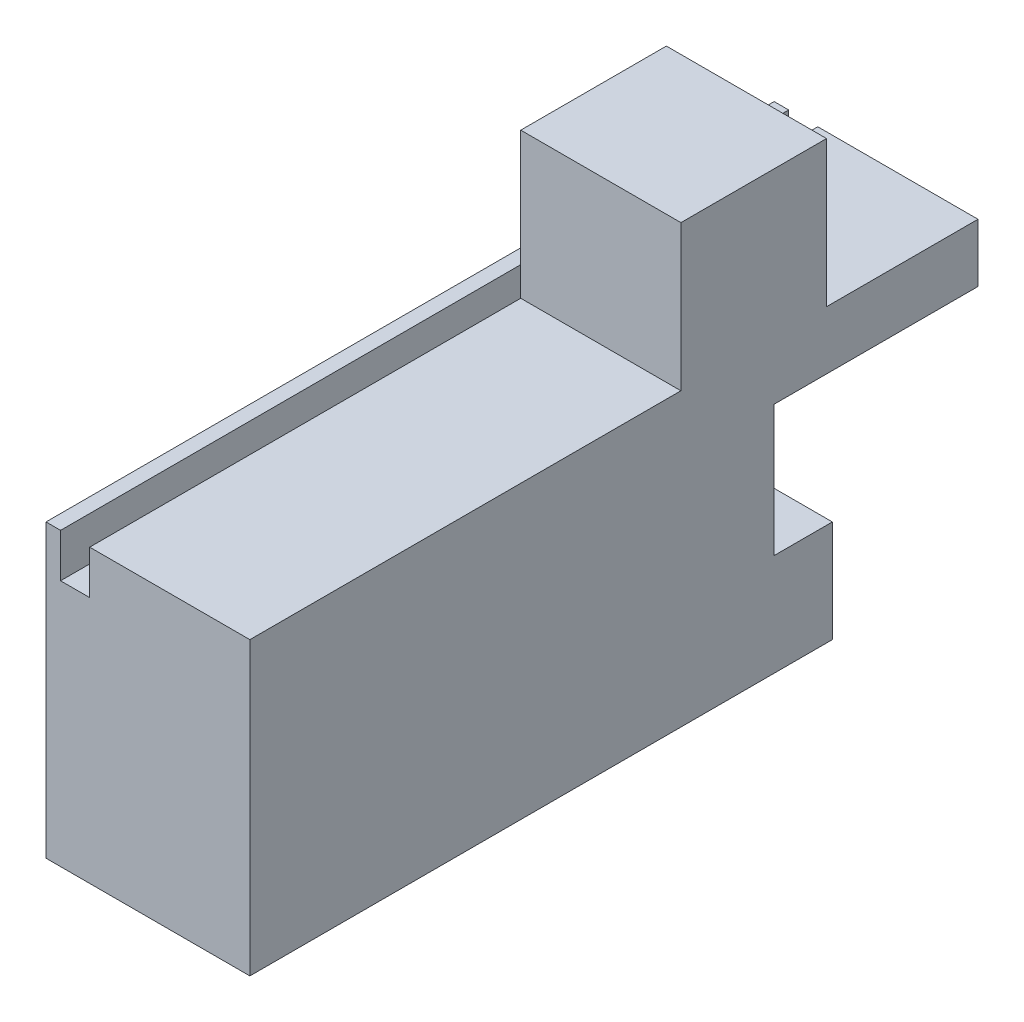
ISO-10303-21;
HEADER;
FILE_DESCRIPTION(('STEP AP214'),'2;1');
FILE_NAME('part.step','',(''),(''),'','','');
FILE_SCHEMA(('AUTOMOTIVE_DESIGN { 1 0 10303 214 1 1 1 1 }'));
ENDSEC;
DATA;
#1=APPLICATION_CONTEXT('core data for automotive mechanical design processes');
#2=APPLICATION_PROTOCOL_DEFINITION('international standard','automotive_design',2000,#1);
#3=PRODUCT_CONTEXT('',#1,'mechanical');
#4=PRODUCT('Part','Part','',(#3));
#5=PRODUCT_RELATED_PRODUCT_CATEGORY('part','',(#4));
#6=PRODUCT_DEFINITION_FORMATION('','',#4);
#7=PRODUCT_DEFINITION_CONTEXT('part definition',#1,'design');
#8=PRODUCT_DEFINITION('design','',#6,#7);
#9=PRODUCT_DEFINITION_SHAPE('','',#8);
#10=(LENGTH_UNIT() NAMED_UNIT(*) SI_UNIT(.MILLI.,.METRE.));
#11=(NAMED_UNIT(*) PLANE_ANGLE_UNIT() SI_UNIT($,.RADIAN.));
#12=(NAMED_UNIT(*) SI_UNIT($,.STERADIAN.) SOLID_ANGLE_UNIT());
#13=UNCERTAINTY_MEASURE_WITH_UNIT(LENGTH_MEASURE(1.E-05),#10,'distance_accuracy_value','');
#14=(GEOMETRIC_REPRESENTATION_CONTEXT(3) GLOBAL_UNCERTAINTY_ASSIGNED_CONTEXT((#13)) GLOBAL_UNIT_ASSIGNED_CONTEXT((#10,
#11,#12)) REPRESENTATION_CONTEXT('',''));
#15=CARTESIAN_POINT('',(0.,0.,0.));
#16=DIRECTION('',(0.,0.,1.));
#17=DIRECTION('',(1.,0.,0.));
#18=AXIS2_PLACEMENT_3D('',#15,#16,#17);
#19=CARTESIAN_POINT('',(2.,3.,50.));
#20=DIRECTION('',(0.,-1.,0.));
#21=DIRECTION('',(0.,0.,-1.));
#22=AXIS2_PLACEMENT_3D('',#19,#20,#21);
#23=PLANE('',#22);
#24=DIRECTION('',(0.,0.,1.));
#25=VECTOR('',#24,1.);
#26=CARTESIAN_POINT('',(13.,3.,50.));
#27=LINE('',#26,#25);
#28=CARTESIAN_POINT('',(13.,3.,20.4));
#29=VERTEX_POINT('',#28);
#30=CARTESIAN_POINT('',(13.,3.,50.));
#31=VERTEX_POINT('',#30);
#32=EDGE_CURVE('E180',#29,#31,#27,.T.);
#33=ORIENTED_EDGE('',*,*,#32,.F.);
#34=DIRECTION('',(1.,0.,0.));
#35=VECTOR('',#34,1.);
#36=CARTESIAN_POINT('',(-12.142135623731,3.,20.4));
#37=LINE('',#36,#35);
#38=CARTESIAN_POINT('',(2.,3.,20.4));
#39=VERTEX_POINT('',#38);
#40=EDGE_CURVE('E287',#39,#29,#37,.T.);
#41=ORIENTED_EDGE('',*,*,#40,.F.);
#42=DIRECTION('',(0.,0.,-1.));
#43=VECTOR('',#42,1.);
#44=CARTESIAN_POINT('',(2.,3.,50.));
#45=LINE('',#44,#43);
#46=CARTESIAN_POINT('',(2.,3.,50.));
#47=VERTEX_POINT('',#46);
#48=EDGE_CURVE('E220',#47,#39,#45,.T.);
#49=ORIENTED_EDGE('',*,*,#48,.F.);
#50=DIRECTION('',(-1.,0.,0.));
#51=VECTOR('',#50,1.);
#52=CARTESIAN_POINT('',(2.,3.,50.));
#53=LINE('',#52,#51);
#54=EDGE_CURVE('E196',#31,#47,#53,.T.);
#55=ORIENTED_EDGE('',*,*,#54,.F.);
#56=EDGE_LOOP('',(#33,#41,#49,#55));
#57=FACE_BOUND('',#56,.T.);
#58=ADVANCED_FACE('F39',(#57),#23,.F.);
#59=CARTESIAN_POINT('',(-0.999999999999993,-17.,14.));
#60=DIRECTION('',(0.,0.,1.));
#61=DIRECTION('',(1.,0.,0.));
#62=AXIS2_PLACEMENT_3D('',#59,#60,#61);
#63=PLANE('',#62);
#64=DIRECTION('',(1.,0.,0.));
#65=VECTOR('',#64,1.);
#66=CARTESIAN_POINT('',(13.,-10.,14.));
#67=LINE('',#66,#65);
#68=CARTESIAN_POINT('',(-0.999999999999994,-10.,14.));
#69=VERTEX_POINT('',#68);
#70=CARTESIAN_POINT('',(13.,-10.,14.));
#71=VERTEX_POINT('',#70);
#72=EDGE_CURVE('E259',#69,#71,#67,.T.);
#73=ORIENTED_EDGE('',*,*,#72,.F.);
#74=DIRECTION('',(0.,1.,0.));
#75=VECTOR('',#74,1.);
#76=CARTESIAN_POINT('',(-0.999999999999993,-17.,14.));
#77=LINE('',#76,#75);
#78=CARTESIAN_POINT('',(-1.,-1.,14.));
#79=VERTEX_POINT('',#78);
#80=EDGE_CURVE('E62',#69,#79,#77,.T.);
#81=ORIENTED_EDGE('',*,*,#80,.T.);
#82=DIRECTION('',(1.,0.,0.));
#83=VECTOR('',#82,1.);
#84=CARTESIAN_POINT('',(-0.999999999999996,-1.,14.));
#85=LINE('',#84,#83);
#86=CARTESIAN_POINT('',(13.,-0.999999999999998,14.));
#87=VERTEX_POINT('',#86);
#88=EDGE_CURVE('E241',#79,#87,#85,.T.);
#89=ORIENTED_EDGE('',*,*,#88,.T.);
#90=DIRECTION('',(0.,1.,0.));
#91=VECTOR('',#90,1.);
#92=CARTESIAN_POINT('',(13.,-17.,14.));
#93=LINE('',#92,#91);
#94=EDGE_CURVE('E247',#71,#87,#93,.T.);
#95=ORIENTED_EDGE('',*,*,#94,.F.);
#96=EDGE_LOOP('',(#73,#81,#89,#95));
#97=FACE_BOUND('',#96,.T.);
#98=ADVANCED_FACE('F258',(#97),#63,.F.);
#99=CARTESIAN_POINT('',(3.,-0.999999999999999,50.));
#100=DIRECTION('',(0.,1.,0.));
#101=DIRECTION('',(-1.,0.,0.));
#102=AXIS2_PLACEMENT_3D('',#99,#100,#101);
#103=PLANE('',#102);
#104=ORIENTED_EDGE('',*,*,#88,.F.);
#105=DIRECTION('',(0.,0.,-1.));
#106=VECTOR('',#105,1.);
#107=CARTESIAN_POINT('',(-1.,-1.,50.));
#108=LINE('',#107,#106);
#109=CARTESIAN_POINT('',(-1.,-1.,0.));
#110=VERTEX_POINT('',#109);
#111=EDGE_CURVE('E223',#79,#110,#108,.T.);
#112=ORIENTED_EDGE('',*,*,#111,.T.);
#113=DIRECTION('',(1.,0.,0.));
#114=VECTOR('',#113,1.);
#115=CARTESIAN_POINT('',(3.,-0.999999999999999,0.));
#116=LINE('',#115,#114);
#117=CARTESIAN_POINT('',(13.,-0.999999999999999,0.));
#118=VERTEX_POINT('',#117);
#119=EDGE_CURVE('E207',#110,#118,#116,.T.);
#120=ORIENTED_EDGE('',*,*,#119,.T.);
#121=DIRECTION('',(0.,0.,-1.));
#122=VECTOR('',#121,1.);
#123=CARTESIAN_POINT('',(13.,-0.999999999999999,50.));
#124=LINE('',#123,#122);
#125=EDGE_CURVE('E240',#87,#118,#124,.T.);
#126=ORIENTED_EDGE('',*,*,#125,.F.);
#127=EDGE_LOOP('',(#104,#112,#120,#126));
#128=FACE_BOUND('',#127,.T.);
#129=ADVANCED_FACE('F239',(#128),#103,.F.);
#130=CARTESIAN_POINT('',(0.,3.,50.));
#131=DIRECTION('',(-1.,0.,0.));
#132=DIRECTION('',(0.,0.,1.));
#133=AXIS2_PLACEMENT_3D('',#130,#131,#132);
#134=PLANE('',#133);
#135=DIRECTION('',(0.,1.,0.));
#136=VECTOR('',#135,1.);
#137=CARTESIAN_POINT('',(0.,3.,0.));
#138=LINE('',#137,#136);
#139=CARTESIAN_POINT('',(0.,0.,0.));
#140=VERTEX_POINT('',#139);
#141=CARTESIAN_POINT('',(0.,3.,0.));
#142=VERTEX_POINT('',#141);
#143=EDGE_CURVE('E179',#140,#142,#138,.T.);
#144=ORIENTED_EDGE('',*,*,#143,.T.);
#145=DIRECTION('',(0.,0.,-1.));
#146=VECTOR('',#145,1.);
#147=CARTESIAN_POINT('',(0.,3.,50.));
#148=LINE('',#147,#146);
#149=CARTESIAN_POINT('',(0.,3.,50.));
#150=VERTEX_POINT('',#149);
#151=EDGE_CURVE('E11',#150,#142,#148,.T.);
#152=ORIENTED_EDGE('',*,*,#151,.F.);
#153=DIRECTION('',(0.,1.,0.));
#154=VECTOR('',#153,1.);
#155=CARTESIAN_POINT('',(0.,3.,50.));
#156=LINE('',#155,#154);
#157=CARTESIAN_POINT('',(0.,0.,50.));
#158=VERTEX_POINT('',#157);
#159=EDGE_CURVE('E188',#158,#150,#156,.T.);
#160=ORIENTED_EDGE('',*,*,#159,.F.);
#161=DIRECTION('',(0.,0.,-1.));
#162=VECTOR('',#161,1.);
#163=CARTESIAN_POINT('',(0.,0.,50.));
#164=LINE('',#163,#162);
#165=EDGE_CURVE('E201',#158,#140,#164,.T.);
#166=ORIENTED_EDGE('',*,*,#165,.T.);
#167=EDGE_LOOP('',(#144,#152,#160,#166));
#168=FACE_BOUND('',#167,.T.);
#169=ADVANCED_FACE('F41',(#168),#134,.F.);
#170=CARTESIAN_POINT('',(-1.,3.,50.));
#171=DIRECTION('',(0.,-1.,0.));
#172=DIRECTION('',(0.,0.,-1.));
#173=AXIS2_PLACEMENT_3D('',#170,#171,#172);
#174=PLANE('',#173);
#175=DIRECTION('',(-1.,0.,0.));
#176=VECTOR('',#175,1.);
#177=CARTESIAN_POINT('',(-1.,3.,0.));
#178=LINE('',#177,#176);
#179=CARTESIAN_POINT('',(-1.,3.,0.));
#180=VERTEX_POINT('',#179);
#181=EDGE_CURVE('E183',#142,#180,#178,.T.);
#182=ORIENTED_EDGE('',*,*,#181,.T.);
#183=DIRECTION('',(0.,0.,-1.));
#184=VECTOR('',#183,1.);
#185=CARTESIAN_POINT('',(-1.,3.,50.));
#186=LINE('',#185,#184);
#187=CARTESIAN_POINT('',(-1.,3.,50.));
#188=VERTEX_POINT('',#187);
#189=EDGE_CURVE('E47',#188,#180,#186,.T.);
#190=ORIENTED_EDGE('',*,*,#189,.F.);
#191=DIRECTION('',(-1.,0.,0.));
#192=VECTOR('',#191,1.);
#193=CARTESIAN_POINT('',(-1.,3.,50.));
#194=LINE('',#193,#192);
#195=EDGE_CURVE('E191',#150,#188,#194,.T.);
#196=ORIENTED_EDGE('',*,*,#195,.F.);
#197=ORIENTED_EDGE('',*,*,#151,.T.);
#198=EDGE_LOOP('',(#182,#190,#196,#197));
#199=FACE_BOUND('',#198,.T.);
#200=ADVANCED_FACE('F357',(#199),#174,.F.);
#201=CARTESIAN_POINT('',(-1.,-1.,50.));
#202=DIRECTION('',(1.,0.,0.));
#203=DIRECTION('',(0.,0.,-1.));
#204=AXIS2_PLACEMENT_3D('',#201,#202,#203);
#205=PLANE('',#204);
#206=DIRECTION('',(0.,-1.,0.));
#207=VECTOR('',#206,1.);
#208=CARTESIAN_POINT('',(-1.,-1.,0.));
#209=LINE('',#208,#207);
#210=EDGE_CURVE('E204',#180,#110,#209,.T.);
#211=ORIENTED_EDGE('',*,*,#210,.T.);
#212=ORIENTED_EDGE('',*,*,#111,.F.);
#213=ORIENTED_EDGE('',*,*,#80,.F.);
#214=DIRECTION('',(0.,0.,1.));
#215=VECTOR('',#214,1.);
#216=CARTESIAN_POINT('',(-0.999999999999994,-10.,10.));
#217=LINE('',#216,#215);
#218=CARTESIAN_POINT('',(-0.999999999999994,-10.,10.));
#219=VERTEX_POINT('',#218);
#220=EDGE_CURVE('E244',#219,#69,#217,.T.);
#221=ORIENTED_EDGE('',*,*,#220,.F.);
#222=DIRECTION('',(0.,1.,0.));
#223=VECTOR('',#222,1.);
#224=CARTESIAN_POINT('',(-0.99999999999999,-17.,10.));
#225=LINE('',#224,#223);
#226=CARTESIAN_POINT('',(-0.99999999999999,-17.,10.));
#227=VERTEX_POINT('',#226);
#228=EDGE_CURVE('E275',#227,#219,#225,.T.);
#229=ORIENTED_EDGE('',*,*,#228,.F.);
#230=DIRECTION('',(0.,0.,-1.));
#231=VECTOR('',#230,1.);
#232=CARTESIAN_POINT('',(-0.999999999999997,-17.,50.));
#233=LINE('',#232,#231);
#234=CARTESIAN_POINT('',(-0.999999999999997,-17.,50.));
#235=VERTEX_POINT('',#234);
#236=EDGE_CURVE('E260',#235,#227,#233,.T.);
#237=ORIENTED_EDGE('',*,*,#236,.F.);
#238=DIRECTION('',(0.,-1.,0.));
#239=VECTOR('',#238,1.);
#240=CARTESIAN_POINT('',(-1.,-1.,50.));
#241=LINE('',#240,#239);
#242=EDGE_CURVE('E194',#188,#235,#241,.T.);
#243=ORIENTED_EDGE('',*,*,#242,.F.);
#244=ORIENTED_EDGE('',*,*,#189,.T.);
#245=EDGE_LOOP('',(#211,#212,#213,#221,#229,#237,#243,#244));
#246=FACE_BOUND('',#245,.T.);
#247=ADVANCED_FACE('F229',(#246),#205,.F.);
#248=CARTESIAN_POINT('',(2.,3.,10.4));
#249=VERTEX_POINT('',#248);
#250=CARTESIAN_POINT('',(2.,3.,0.));
#251=VERTEX_POINT('',#250);
#252=EDGE_CURVE('E173',#249,#251,#45,.T.);
#253=ORIENTED_EDGE('',*,*,#252,.F.);
#254=DIRECTION('',(1.,0.,0.));
#255=VECTOR('',#254,1.);
#256=CARTESIAN_POINT('',(-12.142135623731,3.,10.4));
#257=LINE('',#256,#255);
#258=CARTESIAN_POINT('',(13.,3.,10.4));
#259=VERTEX_POINT('',#258);
#260=EDGE_CURVE('E159',#249,#259,#257,.T.);
#261=ORIENTED_EDGE('',*,*,#260,.T.);
#262=CARTESIAN_POINT('',(13.,3.,0.));
#263=VERTEX_POINT('',#262);
#264=EDGE_CURVE('E172',#263,#259,#27,.T.);
#265=ORIENTED_EDGE('',*,*,#264,.F.);
#266=DIRECTION('',(-1.,0.,0.));
#267=VECTOR('',#266,1.);
#268=CARTESIAN_POINT('',(2.,3.,0.));
#269=LINE('',#268,#267);
#270=EDGE_CURVE('E210',#263,#251,#269,.T.);
#271=ORIENTED_EDGE('',*,*,#270,.T.);
#272=EDGE_LOOP('',(#253,#261,#265,#271));
#273=FACE_BOUND('',#272,.T.);
#274=ADVANCED_FACE('F170',(#273),#23,.F.);
#275=CARTESIAN_POINT('',(2.,0.,50.));
#276=DIRECTION('',(1.,0.,0.));
#277=DIRECTION('',(0.,0.,-1.));
#278=AXIS2_PLACEMENT_3D('',#275,#276,#277);
#279=PLANE('',#278);
#280=CARTESIAN_POINT('',(2.,10.1,15.4));
#281=DIRECTION('',(-1.,0.,0.));
#282=DIRECTION('',(0.,0.,1.));
#283=AXIS2_PLACEMENT_3D('',#280,#281,#282);
#284=CIRCLE('',#283,0.400000000000002);
#285=CARTESIAN_POINT('',(2.,10.1,15.8));
#286=VERTEX_POINT('',#285);
#287=EDGE_CURVE('E294',#286,#286,#284,.T.);
#288=ORIENTED_EDGE('',*,*,#287,.F.);
#289=EDGE_LOOP('',(#288));
#290=FACE_BOUND('',#289,.T.);
#291=DIRECTION('',(0.,-1.,0.));
#292=VECTOR('',#291,1.);
#293=CARTESIAN_POINT('',(2.,0.,0.));
#294=LINE('',#293,#292);
#295=CARTESIAN_POINT('',(2.,0.,0.));
#296=VERTEX_POINT('',#295);
#297=EDGE_CURVE('E212',#251,#296,#294,.T.);
#298=ORIENTED_EDGE('',*,*,#297,.T.);
#299=DIRECTION('',(0.,0.,-1.));
#300=VECTOR('',#299,1.);
#301=CARTESIAN_POINT('',(2.,0.,50.));
#302=LINE('',#301,#300);
#303=CARTESIAN_POINT('',(2.,0.,50.));
#304=VERTEX_POINT('',#303);
#305=EDGE_CURVE('E217',#304,#296,#302,.T.);
#306=ORIENTED_EDGE('',*,*,#305,.F.);
#307=DIRECTION('',(0.,-1.,0.));
#308=VECTOR('',#307,1.);
#309=CARTESIAN_POINT('',(2.,0.,50.));
#310=LINE('',#309,#308);
#311=EDGE_CURVE('E198',#47,#304,#310,.T.);
#312=ORIENTED_EDGE('',*,*,#311,.F.);
#313=ORIENTED_EDGE('',*,*,#48,.T.);
#314=DIRECTION('',(0.,1.,0.));
#315=VECTOR('',#314,1.);
#316=CARTESIAN_POINT('',(2.,3.,20.4));
#317=LINE('',#316,#315);
#318=CARTESIAN_POINT('',(2.,13.,20.4));
#319=VERTEX_POINT('',#318);
#320=EDGE_CURVE('E282',#39,#319,#317,.T.);
#321=ORIENTED_EDGE('',*,*,#320,.T.);
#322=DIRECTION('',(0.,0.,-1.));
#323=VECTOR('',#322,1.);
#324=CARTESIAN_POINT('',(2.,13.,20.4));
#325=LINE('',#324,#323);
#326=CARTESIAN_POINT('',(2.,13.,10.4));
#327=VERTEX_POINT('',#326);
#328=EDGE_CURVE('E289',#319,#327,#325,.T.);
#329=ORIENTED_EDGE('',*,*,#328,.T.);
#330=DIRECTION('',(0.,-1.,0.));
#331=VECTOR('',#330,1.);
#332=CARTESIAN_POINT('',(2.,13.,10.4));
#333=LINE('',#332,#331);
#334=EDGE_CURVE('E273',#327,#249,#333,.T.);
#335=ORIENTED_EDGE('',*,*,#334,.T.);
#336=ORIENTED_EDGE('',*,*,#252,.T.);
#337=EDGE_LOOP('',(#298,#306,#312,#313,#321,#329,#335,#336));
#338=FACE_BOUND('',#337,.T.);
#339=ADVANCED_FACE('F308',(#290,#338),#279,.F.);
#340=CARTESIAN_POINT('',(0.,0.,50.));
#341=DIRECTION('',(0.,-1.,0.));
#342=DIRECTION('',(0.,0.,-1.));
#343=AXIS2_PLACEMENT_3D('',#340,#341,#342);
#344=PLANE('',#343);
#345=DIRECTION('',(-1.,0.,0.));
#346=VECTOR('',#345,1.);
#347=CARTESIAN_POINT('',(0.,0.,0.));
#348=LINE('',#347,#346);
#349=EDGE_CURVE('E192',#296,#140,#348,.T.);
#350=ORIENTED_EDGE('',*,*,#349,.T.);
#351=ORIENTED_EDGE('',*,*,#165,.F.);
#352=DIRECTION('',(-1.,0.,0.));
#353=VECTOR('',#352,1.);
#354=CARTESIAN_POINT('',(0.,0.,50.));
#355=LINE('',#354,#353);
#356=EDGE_CURVE('E200',#304,#158,#355,.T.);
#357=ORIENTED_EDGE('',*,*,#356,.F.);
#358=ORIENTED_EDGE('',*,*,#305,.T.);
#359=EDGE_LOOP('',(#350,#351,#357,#358));
#360=FACE_BOUND('',#359,.T.);
#361=ADVANCED_FACE('F311',(#360),#344,.F.);
#362=CARTESIAN_POINT('',(0.,0.,50.));
#363=DIRECTION('',(0.,0.,1.));
#364=DIRECTION('',(1.,0.,0.));
#365=AXIS2_PLACEMENT_3D('',#362,#363,#364);
#366=PLANE('',#365);
#367=ORIENTED_EDGE('',*,*,#159,.T.);
#368=ORIENTED_EDGE('',*,*,#195,.T.);
#369=ORIENTED_EDGE('',*,*,#242,.T.);
#370=DIRECTION('',(-1.,0.,0.));
#371=VECTOR('',#370,1.);
#372=CARTESIAN_POINT('',(-0.999999999999997,-17.,50.));
#373=LINE('',#372,#371);
#374=CARTESIAN_POINT('',(13.,-17.,50.));
#375=VERTEX_POINT('',#374);
#376=EDGE_CURVE('E250',#375,#235,#373,.T.);
#377=ORIENTED_EDGE('',*,*,#376,.F.);
#378=DIRECTION('',(0.,-1.,0.));
#379=VECTOR('',#378,1.);
#380=CARTESIAN_POINT('',(13.,3.,50.));
#381=LINE('',#380,#379);
#382=EDGE_CURVE('E246',#31,#375,#381,.T.);
#383=ORIENTED_EDGE('',*,*,#382,.F.);
#384=ORIENTED_EDGE('',*,*,#54,.T.);
#385=ORIENTED_EDGE('',*,*,#311,.T.);
#386=ORIENTED_EDGE('',*,*,#356,.T.);
#387=EDGE_LOOP('',(#367,#368,#369,#377,#383,#384,#385,#386));
#388=FACE_BOUND('',#387,.T.);
#389=ADVANCED_FACE('F324',(#388),#366,.T.);
#390=CARTESIAN_POINT('',(0.,0.,0.));
#391=DIRECTION('',(0.,0.,1.));
#392=DIRECTION('',(1.,0.,0.));
#393=AXIS2_PLACEMENT_3D('',#390,#391,#392);
#394=PLANE('',#393);
#395=ORIENTED_EDGE('',*,*,#143,.F.);
#396=ORIENTED_EDGE('',*,*,#349,.F.);
#397=ORIENTED_EDGE('',*,*,#297,.F.);
#398=ORIENTED_EDGE('',*,*,#270,.F.);
#399=DIRECTION('',(0.,1.,0.));
#400=VECTOR('',#399,1.);
#401=CARTESIAN_POINT('',(13.,3.,0.));
#402=LINE('',#401,#400);
#403=EDGE_CURVE('E178',#118,#263,#402,.T.);
#404=ORIENTED_EDGE('',*,*,#403,.F.);
#405=ORIENTED_EDGE('',*,*,#119,.F.);
#406=ORIENTED_EDGE('',*,*,#210,.F.);
#407=ORIENTED_EDGE('',*,*,#181,.F.);
#408=EDGE_LOOP('',(#395,#396,#397,#398,#404,#405,#406,#407));
#409=FACE_BOUND('',#408,.T.);
#410=ADVANCED_FACE('F236',(#409),#394,.F.);
#411=CARTESIAN_POINT('',(13.,0.,0.));
#412=DIRECTION('',(1.,0.,0.));
#413=DIRECTION('',(0.,0.,-1.));
#414=AXIS2_PLACEMENT_3D('',#411,#412,#413);
#415=PLANE('',#414);
#416=ORIENTED_EDGE('',*,*,#382,.T.);
#417=DIRECTION('',(0.,0.,1.));
#418=VECTOR('',#417,1.);
#419=CARTESIAN_POINT('',(13.,-17.,50.));
#420=LINE('',#419,#418);
#421=CARTESIAN_POINT('',(13.,-17.,10.));
#422=VERTEX_POINT('',#421);
#423=EDGE_CURVE('E261',#422,#375,#420,.T.);
#424=ORIENTED_EDGE('',*,*,#423,.F.);
#425=DIRECTION('',(0.,-1.,0.));
#426=VECTOR('',#425,1.);
#427=CARTESIAN_POINT('',(13.,-17.,10.));
#428=LINE('',#427,#426);
#429=CARTESIAN_POINT('',(13.,-10.,10.));
#430=VERTEX_POINT('',#429);
#431=EDGE_CURVE('E272',#430,#422,#428,.T.);
#432=ORIENTED_EDGE('',*,*,#431,.F.);
#433=DIRECTION('',(0.,0.,1.));
#434=VECTOR('',#433,1.);
#435=CARTESIAN_POINT('',(13.,-10.,10.));
#436=LINE('',#435,#434);
#437=EDGE_CURVE('E257',#430,#71,#436,.T.);
#438=ORIENTED_EDGE('',*,*,#437,.T.);
#439=ORIENTED_EDGE('',*,*,#94,.T.);
#440=ORIENTED_EDGE('',*,*,#125,.T.);
#441=ORIENTED_EDGE('',*,*,#403,.T.);
#442=ORIENTED_EDGE('',*,*,#264,.T.);
#443=DIRECTION('',(0.,1.,0.));
#444=VECTOR('',#443,1.);
#445=CARTESIAN_POINT('',(13.,13.,10.4));
#446=LINE('',#445,#444);
#447=CARTESIAN_POINT('',(13.,13.,10.4));
#448=VERTEX_POINT('',#447);
#449=EDGE_CURVE('E155',#259,#448,#446,.T.);
#450=ORIENTED_EDGE('',*,*,#449,.T.);
#451=DIRECTION('',(0.,0.,1.));
#452=VECTOR('',#451,1.);
#453=CARTESIAN_POINT('',(13.,13.,20.4));
#454=LINE('',#453,#452);
#455=CARTESIAN_POINT('',(13.,13.,20.4));
#456=VERTEX_POINT('',#455);
#457=EDGE_CURVE('E165',#448,#456,#454,.T.);
#458=ORIENTED_EDGE('',*,*,#457,.T.);
#459=DIRECTION('',(0.,-1.,0.));
#460=VECTOR('',#459,1.);
#461=CARTESIAN_POINT('',(13.,3.,20.4));
#462=LINE('',#461,#460);
#463=EDGE_CURVE('E54',#456,#29,#462,.T.);
#464=ORIENTED_EDGE('',*,*,#463,.T.);
#465=ORIENTED_EDGE('',*,*,#32,.T.);
#466=EDGE_LOOP('',(#416,#424,#432,#438,#439,#440,#441,#442,#450,#458,#464,#465));
#467=FACE_BOUND('',#466,.T.);
#468=ADVANCED_FACE('F176',(#467),#415,.T.);
#469=CARTESIAN_POINT('',(0.,-17.,0.));
#470=DIRECTION('',(0.,-1.,0.));
#471=DIRECTION('',(1.,0.,0.));
#472=AXIS2_PLACEMENT_3D('',#469,#470,#471);
#473=PLANE('',#472);
#474=ORIENTED_EDGE('',*,*,#236,.T.);
#475=DIRECTION('',(-1.,0.,0.));
#476=VECTOR('',#475,1.);
#477=CARTESIAN_POINT('',(13.,-17.,10.));
#478=LINE('',#477,#476);
#479=EDGE_CURVE('E277',#422,#227,#478,.T.);
#480=ORIENTED_EDGE('',*,*,#479,.F.);
#481=ORIENTED_EDGE('',*,*,#423,.T.);
#482=ORIENTED_EDGE('',*,*,#376,.T.);
#483=EDGE_LOOP('',(#474,#480,#481,#482));
#484=FACE_BOUND('',#483,.T.);
#485=ADVANCED_FACE('F427',(#484),#473,.T.);
#486=CARTESIAN_POINT('',(13.,-10.,10.));
#487=DIRECTION('',(0.,-1.,0.));
#488=DIRECTION('',(0.,0.,-1.));
#489=AXIS2_PLACEMENT_3D('',#486,#487,#488);
#490=PLANE('',#489);
#491=ORIENTED_EDGE('',*,*,#72,.T.);
#492=ORIENTED_EDGE('',*,*,#437,.F.);
#493=DIRECTION('',(1.,0.,0.));
#494=VECTOR('',#493,1.);
#495=CARTESIAN_POINT('',(13.,-10.,10.));
#496=LINE('',#495,#494);
#497=EDGE_CURVE('E270',#219,#430,#496,.T.);
#498=ORIENTED_EDGE('',*,*,#497,.F.);
#499=ORIENTED_EDGE('',*,*,#220,.T.);
#500=EDGE_LOOP('',(#491,#492,#498,#499));
#501=FACE_BOUND('',#500,.T.);
#502=ADVANCED_FACE('F432',(#501),#490,.F.);
#503=CARTESIAN_POINT('',(0.,0.,10.));
#504=DIRECTION('',(0.,0.,1.));
#505=DIRECTION('',(1.,0.,0.));
#506=AXIS2_PLACEMENT_3D('',#503,#504,#505);
#507=PLANE('',#506);
#508=ORIENTED_EDGE('',*,*,#431,.T.);
#509=ORIENTED_EDGE('',*,*,#479,.T.);
#510=ORIENTED_EDGE('',*,*,#228,.T.);
#511=ORIENTED_EDGE('',*,*,#497,.T.);
#512=EDGE_LOOP('',(#508,#509,#510,#511));
#513=FACE_BOUND('',#512,.T.);
#514=ADVANCED_FACE('F344',(#513),#507,.F.);
#515=CARTESIAN_POINT('',(-12.142135623731,3.,20.4));
#516=DIRECTION('',(0.,0.,1.));
#517=DIRECTION('',(1.,0.,0.));
#518=AXIS2_PLACEMENT_3D('',#515,#516,#517);
#519=PLANE('',#518);
#520=ORIENTED_EDGE('',*,*,#320,.F.);
#521=ORIENTED_EDGE('',*,*,#40,.T.);
#522=ORIENTED_EDGE('',*,*,#463,.F.);
#523=DIRECTION('',(1.,0.,0.));
#524=VECTOR('',#523,1.);
#525=CARTESIAN_POINT('',(-12.142135623731,13.,20.4));
#526=LINE('',#525,#524);
#527=EDGE_CURVE('E285',#319,#456,#526,.T.);
#528=ORIENTED_EDGE('',*,*,#527,.F.);
#529=EDGE_LOOP('',(#520,#521,#522,#528));
#530=FACE_BOUND('',#529,.T.);
#531=ADVANCED_FACE('F333',(#530),#519,.T.);
#532=CARTESIAN_POINT('',(-12.142135623731,13.,20.4));
#533=DIRECTION('',(0.,1.,0.));
#534=DIRECTION('',(0.,0.,1.));
#535=AXIS2_PLACEMENT_3D('',#532,#533,#534);
#536=PLANE('',#535);
#537=ORIENTED_EDGE('',*,*,#328,.F.);
#538=ORIENTED_EDGE('',*,*,#527,.T.);
#539=ORIENTED_EDGE('',*,*,#457,.F.);
#540=DIRECTION('',(1.,0.,0.));
#541=VECTOR('',#540,1.);
#542=CARTESIAN_POINT('',(-12.142135623731,13.,10.4));
#543=LINE('',#542,#541);
#544=EDGE_CURVE('E162',#327,#448,#543,.T.);
#545=ORIENTED_EDGE('',*,*,#544,.F.);
#546=EDGE_LOOP('',(#537,#538,#539,#545));
#547=FACE_BOUND('',#546,.T.);
#548=ADVANCED_FACE('F336',(#547),#536,.T.);
#549=CARTESIAN_POINT('',(-12.142135623731,13.,10.4));
#550=DIRECTION('',(0.,0.,-1.));
#551=DIRECTION('',(-1.,0.,0.));
#552=AXIS2_PLACEMENT_3D('',#549,#550,#551);
#553=PLANE('',#552);
#554=ORIENTED_EDGE('',*,*,#334,.F.);
#555=ORIENTED_EDGE('',*,*,#544,.T.);
#556=ORIENTED_EDGE('',*,*,#449,.F.);
#557=ORIENTED_EDGE('',*,*,#260,.F.);
#558=EDGE_LOOP('',(#554,#555,#556,#557));
#559=FACE_BOUND('',#558,.T.);
#560=ADVANCED_FACE('F158',(#559),#553,.T.);
#561=CARTESIAN_POINT('',(9.,10.1,15.4));
#562=DIRECTION('',(-1.,0.,0.));
#563=DIRECTION('',(0.,0.,1.));
#564=AXIS2_PLACEMENT_3D('',#561,#562,#563);
#565=CYLINDRICAL_SURFACE('',#564,0.400000000000002);
#566=CARTESIAN_POINT('',(9.,10.1,15.4));
#567=DIRECTION('',(-1.,0.,0.));
#568=DIRECTION('',(0.,0.,1.));
#569=AXIS2_PLACEMENT_3D('',#566,#567,#568);
#570=CIRCLE('',#569,0.400000000000002);
#571=CARTESIAN_POINT('',(9.,10.1,15.8));
#572=VERTEX_POINT('',#571);
#573=EDGE_CURVE('E166',#572,#572,#570,.T.);
#574=ORIENTED_EDGE('',*,*,#573,.F.);
#575=EDGE_LOOP('',(#574));
#576=FACE_BOUND('',#575,.T.);
#577=ORIENTED_EDGE('',*,*,#287,.T.);
#578=EDGE_LOOP('',(#577));
#579=FACE_BOUND('',#578,.T.);
#580=ADVANCED_FACE('F302',(#576,#579),#565,.F.);
#581=CARTESIAN_POINT('',(9.,10.1,15.4));
#582=DIRECTION('',(-1.,0.,0.));
#583=DIRECTION('',(0.,0.,1.));
#584=AXIS2_PLACEMENT_3D('',#581,#582,#583);
#585=PLANE('',#584);
#586=ORIENTED_EDGE('',*,*,#573,.T.);
#587=EDGE_LOOP('',(#586));
#588=FACE_BOUND('',#587,.T.);
#589=ADVANCED_FACE('F300',(#588),#585,.T.);
#590=CLOSED_SHELL('',(#58,#98,#129,#169,#200,#247,#274,#339,#361,#389,#410,#468,#485,#502,#514,
#531,#548,#560,#580,#589));
#591=MANIFOLD_SOLID_BREP('B2',#590);
#592=ADVANCED_BREP_SHAPE_REPRESENTATION('',(#18,#591),#14);
#593=SHAPE_DEFINITION_REPRESENTATION(#9,#592);
ENDSEC;
END-ISO-10303-21;
